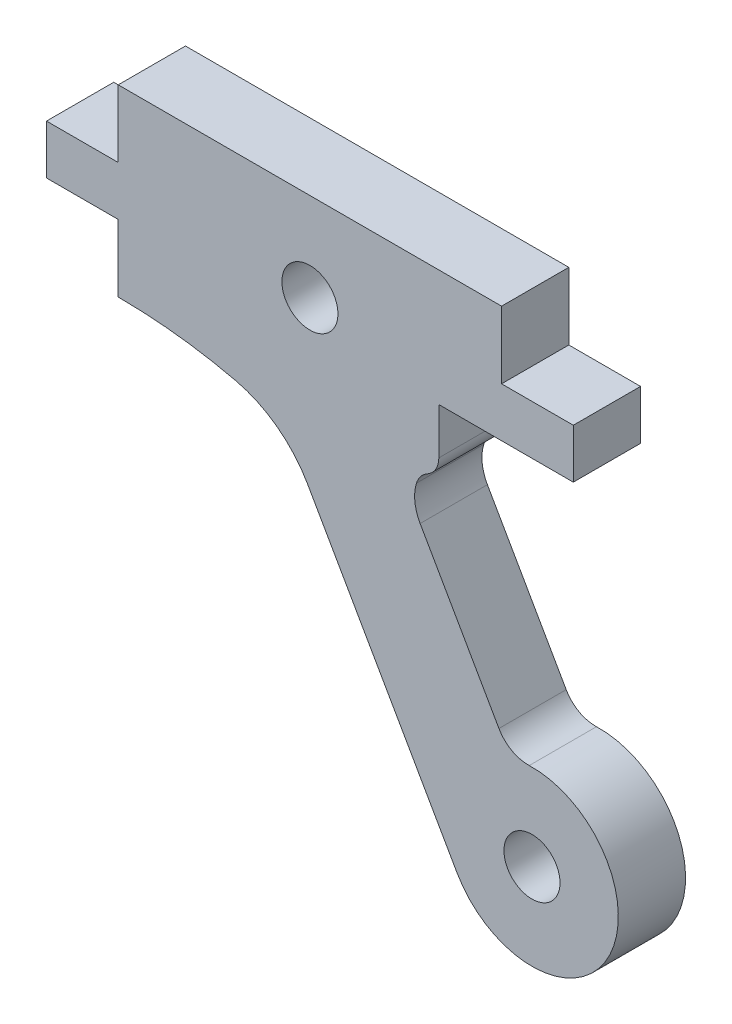
ISO-10303-21;
HEADER;
FILE_DESCRIPTION(('STEP AP214'),'2;1');
FILE_NAME('part.step','',(''),(''),'','','');
FILE_SCHEMA(('AUTOMOTIVE_DESIGN { 1 0 10303 214 1 1 1 1 }'));
ENDSEC;
DATA;
#1=APPLICATION_CONTEXT('core data for automotive mechanical design processes');
#2=APPLICATION_PROTOCOL_DEFINITION('international standard','automotive_design',2000,#1);
#3=PRODUCT_CONTEXT('',#1,'mechanical');
#4=PRODUCT('Part','Part','',(#3));
#5=PRODUCT_RELATED_PRODUCT_CATEGORY('part','',(#4));
#6=PRODUCT_DEFINITION_FORMATION('','',#4);
#7=PRODUCT_DEFINITION_CONTEXT('part definition',#1,'design');
#8=PRODUCT_DEFINITION('design','',#6,#7);
#9=PRODUCT_DEFINITION_SHAPE('','',#8);
#10=(LENGTH_UNIT() NAMED_UNIT(*) SI_UNIT(.MILLI.,.METRE.));
#11=(NAMED_UNIT(*) PLANE_ANGLE_UNIT() SI_UNIT($,.RADIAN.));
#12=(NAMED_UNIT(*) SI_UNIT($,.STERADIAN.) SOLID_ANGLE_UNIT());
#13=UNCERTAINTY_MEASURE_WITH_UNIT(LENGTH_MEASURE(1.E-05),#10,'distance_accuracy_value','');
#14=(GEOMETRIC_REPRESENTATION_CONTEXT(3) GLOBAL_UNCERTAINTY_ASSIGNED_CONTEXT((#13)) GLOBAL_UNIT_ASSIGNED_CONTEXT((#10,
#11,#12)) REPRESENTATION_CONTEXT('',''));
#15=CARTESIAN_POINT('',(0.,0.,0.));
#16=DIRECTION('',(0.,0.,1.));
#17=DIRECTION('',(1.,0.,0.));
#18=AXIS2_PLACEMENT_3D('',#15,#16,#17);
#19=CARTESIAN_POINT('',(-230.853955802603,-686.690990553707,-3.));
#20=DIRECTION('',(-1.,0.,0.));
#21=DIRECTION('',(0.,0.,1.));
#22=AXIS2_PLACEMENT_3D('',#19,#20,#21);
#23=PLANE('',#22);
#24=DIRECTION('',(0.,-1.,0.));
#25=VECTOR('',#24,1.);
#26=CARTESIAN_POINT('',(-230.853955802603,-686.690990553707,0.));
#27=LINE('',#26,#25);
#28=CARTESIAN_POINT('',(-230.853955802603,-686.690990553707,0.));
#29=VERTEX_POINT('',#28);
#30=CARTESIAN_POINT('',(-230.853955802603,-689.690990553707,0.));
#31=VERTEX_POINT('',#30);
#32=EDGE_CURVE('E208',#29,#31,#27,.T.);
#33=ORIENTED_EDGE('',*,*,#32,.F.);
#34=DIRECTION('',(0.,0.,1.));
#35=VECTOR('',#34,1.);
#36=CARTESIAN_POINT('',(-230.853955802603,-686.690990553707,-3.));
#37=LINE('',#36,#35);
#38=CARTESIAN_POINT('',(-230.853955802603,-686.690990553707,-3.));
#39=VERTEX_POINT('',#38);
#40=EDGE_CURVE('E11',#39,#29,#37,.T.);
#41=ORIENTED_EDGE('',*,*,#40,.F.);
#42=DIRECTION('',(0.,-1.,0.));
#43=VECTOR('',#42,1.);
#44=CARTESIAN_POINT('',(-230.853955802603,-686.690990553707,-3.));
#45=LINE('',#44,#43);
#46=CARTESIAN_POINT('',(-230.853955802603,-689.690990553707,-3.));
#47=VERTEX_POINT('',#46);
#48=EDGE_CURVE('E265',#39,#47,#45,.T.);
#49=ORIENTED_EDGE('',*,*,#48,.T.);
#50=DIRECTION('',(0.,0.,1.));
#51=VECTOR('',#50,1.);
#52=CARTESIAN_POINT('',(-230.853955802603,-689.690990553707,-3.));
#53=LINE('',#52,#51);
#54=EDGE_CURVE('E42',#47,#31,#53,.T.);
#55=ORIENTED_EDGE('',*,*,#54,.T.);
#56=EDGE_LOOP('',(#33,#41,#49,#55));
#57=FACE_BOUND('',#56,.T.);
#58=ADVANCED_FACE('F39',(#57),#23,.T.);
#59=CARTESIAN_POINT('',(-230.853955802603,-686.690990553707,-3.));
#60=DIRECTION('',(0.,1.,0.));
#61=DIRECTION('',(0.,0.,1.));
#62=AXIS2_PLACEMENT_3D('',#59,#60,#61);
#63=PLANE('',#62);
#64=DIRECTION('',(-1.,0.,0.));
#65=VECTOR('',#64,1.);
#66=CARTESIAN_POINT('',(-230.853955802603,-686.690990553707,0.));
#67=LINE('',#66,#65);
#68=CARTESIAN_POINT('',(-213.753955802603,-686.690990553707,0.));
#69=VERTEX_POINT('',#68);
#70=EDGE_CURVE('E263',#69,#29,#67,.T.);
#71=ORIENTED_EDGE('',*,*,#70,.F.);
#72=DIRECTION('',(0.,0.,1.));
#73=VECTOR('',#72,1.);
#74=CARTESIAN_POINT('',(-213.753955802603,-686.690990553707,-3.));
#75=LINE('',#74,#73);
#76=CARTESIAN_POINT('',(-213.753955802603,-686.690990553707,-3.));
#77=VERTEX_POINT('',#76);
#78=EDGE_CURVE('E48',#77,#69,#75,.T.);
#79=ORIENTED_EDGE('',*,*,#78,.F.);
#80=DIRECTION('',(-1.,0.,0.));
#81=VECTOR('',#80,1.);
#82=CARTESIAN_POINT('',(-230.853955802603,-686.690990553707,-3.));
#83=LINE('',#82,#81);
#84=EDGE_CURVE('E198',#77,#39,#83,.T.);
#85=ORIENTED_EDGE('',*,*,#84,.T.);
#86=ORIENTED_EDGE('',*,*,#40,.T.);
#87=EDGE_LOOP('',(#71,#79,#85,#86));
#88=FACE_BOUND('',#87,.T.);
#89=ADVANCED_FACE('F301',(#88),#63,.T.);
#90=CARTESIAN_POINT('',(-213.753955802603,-686.690990553707,-3.));
#91=DIRECTION('',(1.,0.,0.));
#92=DIRECTION('',(0.,0.,-1.));
#93=AXIS2_PLACEMENT_3D('',#90,#91,#92);
#94=PLANE('',#93);
#95=DIRECTION('',(0.,1.,0.));
#96=VECTOR('',#95,1.);
#97=CARTESIAN_POINT('',(-213.753955802603,-686.690990553707,0.));
#98=LINE('',#97,#96);
#99=CARTESIAN_POINT('',(-213.753955802603,-689.690990553707,0.));
#100=VERTEX_POINT('',#99);
#101=EDGE_CURVE('E185',#100,#69,#98,.T.);
#102=ORIENTED_EDGE('',*,*,#101,.F.);
#103=DIRECTION('',(0.,0.,1.));
#104=VECTOR('',#103,1.);
#105=CARTESIAN_POINT('',(-213.753955802603,-689.690990553707,-3.));
#106=LINE('',#105,#104);
#107=CARTESIAN_POINT('',(-213.753955802603,-689.690990553707,-3.));
#108=VERTEX_POINT('',#107);
#109=EDGE_CURVE('E180',#108,#100,#106,.T.);
#110=ORIENTED_EDGE('',*,*,#109,.F.);
#111=DIRECTION('',(0.,1.,0.));
#112=VECTOR('',#111,1.);
#113=CARTESIAN_POINT('',(-213.753955802603,-686.690990553707,-3.));
#114=LINE('',#113,#112);
#115=EDGE_CURVE('E183',#108,#77,#114,.T.);
#116=ORIENTED_EDGE('',*,*,#115,.T.);
#117=ORIENTED_EDGE('',*,*,#78,.T.);
#118=EDGE_LOOP('',(#102,#110,#116,#117));
#119=FACE_BOUND('',#118,.T.);
#120=ADVANCED_FACE('F182',(#119),#94,.T.);
#121=CARTESIAN_POINT('',(-213.753955802603,-689.690990553707,-3.));
#122=DIRECTION('',(0.,1.,0.));
#123=DIRECTION('',(0.,0.,1.));
#124=AXIS2_PLACEMENT_3D('',#121,#122,#123);
#125=PLANE('',#124);
#126=DIRECTION('',(-1.,0.,0.));
#127=VECTOR('',#126,1.);
#128=CARTESIAN_POINT('',(-213.753955802603,-689.690990553707,0.));
#129=LINE('',#128,#127);
#130=CARTESIAN_POINT('',(-210.553955802603,-689.690990553707,0.));
#131=VERTEX_POINT('',#130);
#132=EDGE_CURVE('E260',#131,#100,#129,.T.);
#133=ORIENTED_EDGE('',*,*,#132,.F.);
#134=DIRECTION('',(0.,0.,1.));
#135=VECTOR('',#134,1.);
#136=CARTESIAN_POINT('',(-210.553955802603,-689.690990553707,-3.));
#137=LINE('',#136,#135);
#138=CARTESIAN_POINT('',(-210.553955802603,-689.690990553707,-3.));
#139=VERTEX_POINT('',#138);
#140=EDGE_CURVE('E190',#139,#131,#137,.T.);
#141=ORIENTED_EDGE('',*,*,#140,.F.);
#142=DIRECTION('',(-1.,0.,0.));
#143=VECTOR('',#142,1.);
#144=CARTESIAN_POINT('',(-213.753955802603,-689.690990553707,-3.));
#145=LINE('',#144,#143);
#146=EDGE_CURVE('E196',#139,#108,#145,.T.);
#147=ORIENTED_EDGE('',*,*,#146,.T.);
#148=ORIENTED_EDGE('',*,*,#109,.T.);
#149=EDGE_LOOP('',(#133,#141,#147,#148));
#150=FACE_BOUND('',#149,.T.);
#151=ADVANCED_FACE('F200',(#150),#125,.T.);
#152=CARTESIAN_POINT('',(-210.553955802603,-689.690990553707,-3.));
#153=DIRECTION('',(1.,0.,0.));
#154=DIRECTION('',(0.,0.,-1.));
#155=AXIS2_PLACEMENT_3D('',#152,#153,#154);
#156=PLANE('',#155);
#157=DIRECTION('',(0.,1.,0.));
#158=VECTOR('',#157,1.);
#159=CARTESIAN_POINT('',(-210.553955802603,-689.690990553707,0.));
#160=LINE('',#159,#158);
#161=CARTESIAN_POINT('',(-210.553955802603,-691.890990553707,0.));
#162=VERTEX_POINT('',#161);
#163=EDGE_CURVE('E257',#162,#131,#160,.T.);
#164=ORIENTED_EDGE('',*,*,#163,.F.);
#165=DIRECTION('',(0.,0.,1.));
#166=VECTOR('',#165,1.);
#167=CARTESIAN_POINT('',(-210.553955802603,-691.890990553707,-3.));
#168=LINE('',#167,#166);
#169=CARTESIAN_POINT('',(-210.553955802603,-691.890990553707,-3.));
#170=VERTEX_POINT('',#169);
#171=EDGE_CURVE('E269',#170,#162,#168,.T.);
#172=ORIENTED_EDGE('',*,*,#171,.F.);
#173=DIRECTION('',(0.,1.,0.));
#174=VECTOR('',#173,1.);
#175=CARTESIAN_POINT('',(-210.553955802603,-689.690990553707,-3.));
#176=LINE('',#175,#174);
#177=EDGE_CURVE('E201',#170,#139,#176,.T.);
#178=ORIENTED_EDGE('',*,*,#177,.T.);
#179=ORIENTED_EDGE('',*,*,#140,.T.);
#180=EDGE_LOOP('',(#164,#172,#178,#179));
#181=FACE_BOUND('',#180,.T.);
#182=ADVANCED_FACE('F314',(#181),#156,.T.);
#183=CARTESIAN_POINT('',(-210.553955802603,-691.890990553707,-3.));
#184=DIRECTION('',(0.,-1.,0.));
#185=DIRECTION('',(0.,0.,-1.));
#186=AXIS2_PLACEMENT_3D('',#183,#184,#185);
#187=PLANE('',#186);
#188=DIRECTION('',(1.,0.,0.));
#189=VECTOR('',#188,1.);
#190=CARTESIAN_POINT('',(-210.553955802603,-691.890990553707,0.));
#191=LINE('',#190,#189);
#192=CARTESIAN_POINT('',(-216.553955802603,-691.890990553707,0.));
#193=VERTEX_POINT('',#192);
#194=EDGE_CURVE('E254',#193,#162,#191,.T.);
#195=ORIENTED_EDGE('',*,*,#194,.F.);
#196=DIRECTION('',(0.,0.,1.));
#197=VECTOR('',#196,1.);
#198=CARTESIAN_POINT('',(-216.553955802603,-691.890990553707,-3.));
#199=LINE('',#198,#197);
#200=CARTESIAN_POINT('',(-216.553955802603,-691.890990553707,-3.));
#201=VERTEX_POINT('',#200);
#202=EDGE_CURVE('E271',#201,#193,#199,.T.);
#203=ORIENTED_EDGE('',*,*,#202,.F.);
#204=DIRECTION('',(1.,0.,0.));
#205=VECTOR('',#204,1.);
#206=CARTESIAN_POINT('',(-210.553955802603,-691.890990553707,-3.));
#207=LINE('',#206,#205);
#208=EDGE_CURVE('E203',#201,#170,#207,.T.);
#209=ORIENTED_EDGE('',*,*,#208,.T.);
#210=ORIENTED_EDGE('',*,*,#171,.T.);
#211=EDGE_LOOP('',(#195,#203,#209,#210));
#212=FACE_BOUND('',#211,.T.);
#213=ADVANCED_FACE('F317',(#212),#187,.T.);
#214=CARTESIAN_POINT('',(-216.553955802603,-691.890990553707,-3.));
#215=DIRECTION('',(1.,0.,0.));
#216=DIRECTION('',(0.,0.,-1.));
#217=AXIS2_PLACEMENT_3D('',#214,#215,#216);
#218=PLANE('',#217);
#219=DIRECTION('',(0.,1.,0.));
#220=VECTOR('',#219,1.);
#221=CARTESIAN_POINT('',(-216.553955802603,-691.890990553707,0.));
#222=LINE('',#221,#220);
#223=CARTESIAN_POINT('',(-216.553955802603,-693.952807749183,0.));
#224=VERTEX_POINT('',#223);
#225=EDGE_CURVE('E251',#224,#193,#222,.T.);
#226=ORIENTED_EDGE('',*,*,#225,.F.);
#227=DIRECTION('',(0.,0.,1.));
#228=VECTOR('',#227,1.);
#229=CARTESIAN_POINT('',(-216.553955802603,-693.952807749183,-3.));
#230=LINE('',#229,#228);
#231=CARTESIAN_POINT('',(-216.553955802603,-693.952807749183,-3.));
#232=VERTEX_POINT('',#231);
#233=EDGE_CURVE('E273',#232,#224,#230,.T.);
#234=ORIENTED_EDGE('',*,*,#233,.F.);
#235=DIRECTION('',(0.,1.,0.));
#236=VECTOR('',#235,1.);
#237=CARTESIAN_POINT('',(-216.553955802603,-691.890990553707,-3.));
#238=LINE('',#237,#236);
#239=EDGE_CURVE('E447',#232,#201,#238,.T.);
#240=ORIENTED_EDGE('',*,*,#239,.T.);
#241=ORIENTED_EDGE('',*,*,#202,.T.);
#242=EDGE_LOOP('',(#226,#234,#240,#241));
#243=FACE_BOUND('',#242,.T.);
#244=ADVANCED_FACE('F321',(#243),#218,.T.);
#245=CARTESIAN_POINT('',(-217.553955802603,-693.952807749183,-3.));
#246=DIRECTION('',(0.,0.,1.));
#247=DIRECTION('',(1.,0.,0.));
#248=AXIS2_PLACEMENT_3D('',#245,#246,#247);
#249=CYLINDRICAL_SURFACE('',#248,0.999999999999994);
#250=CARTESIAN_POINT('',(-217.553955802603,-693.952807749183,0.));
#251=DIRECTION('',(0.,0.,1.));
#252=DIRECTION('',(-1.,0.,0.));
#253=AXIS2_PLACEMENT_3D('',#250,#251,#252);
#254=CIRCLE('',#253,0.999999999999994);
#255=CARTESIAN_POINT('',(-217.06391298613,-694.824506113311,0.));
#256=VERTEX_POINT('',#255);
#257=EDGE_CURVE('E248',#256,#224,#254,.T.);
#258=ORIENTED_EDGE('',*,*,#257,.F.);
#259=DIRECTION('',(0.,0.,1.));
#260=VECTOR('',#259,1.);
#261=CARTESIAN_POINT('',(-217.06391298613,-694.824506113311,-3.));
#262=LINE('',#261,#260);
#263=CARTESIAN_POINT('',(-217.06391298613,-694.824506113311,-3.));
#264=VERTEX_POINT('',#263);
#265=EDGE_CURVE('E275',#264,#256,#262,.T.);
#266=ORIENTED_EDGE('',*,*,#265,.F.);
#267=CARTESIAN_POINT('',(-217.553955802603,-693.952807749183,-3.));
#268=DIRECTION('',(0.,0.,1.));
#269=DIRECTION('',(-1.,0.,0.));
#270=AXIS2_PLACEMENT_3D('',#267,#268,#269);
#271=CIRCLE('',#270,0.999999999999994);
#272=EDGE_CURVE('E444',#264,#232,#271,.T.);
#273=ORIENTED_EDGE('',*,*,#272,.T.);
#274=ORIENTED_EDGE('',*,*,#233,.T.);
#275=EDGE_LOOP('',(#258,#266,#273,#274));
#276=FACE_BOUND('',#275,.T.);
#277=ADVANCED_FACE('F325',(#276),#249,.T.);
#278=CARTESIAN_POINT('',(-216.553955802603,-695.73162856815,-3.));
#279=DIRECTION('',(0.,0.,1.));
#280=DIRECTION('',(1.,0.,0.));
#281=AXIS2_PLACEMENT_3D('',#278,#279,#280);
#282=CYLINDRICAL_SURFACE('',#281,1.04063801444277);
#283=CARTESIAN_POINT('',(-216.553955802603,-695.73162856815,0.));
#284=DIRECTION('',(0.,0.,-1.));
#285=DIRECTION('',(-1.,0.,0.));
#286=AXIS2_PLACEMENT_3D('',#283,#284,#285);
#287=CIRCLE('',#286,1.04063801444277);
#288=CARTESIAN_POINT('',(-217.547910270791,-695.423437081777,0.));
#289=VERTEX_POINT('',#288);
#290=EDGE_CURVE('E245',#289,#256,#287,.T.);
#291=ORIENTED_EDGE('',*,*,#290,.F.);
#292=DIRECTION('',(0.,0.,1.));
#293=VECTOR('',#292,1.);
#294=CARTESIAN_POINT('',(-217.547910270791,-695.423437081777,-3.));
#295=LINE('',#294,#293);
#296=CARTESIAN_POINT('',(-217.547910270791,-695.423437081777,-3.));
#297=VERTEX_POINT('',#296);
#298=EDGE_CURVE('E277',#297,#289,#295,.T.);
#299=ORIENTED_EDGE('',*,*,#298,.F.);
#300=CARTESIAN_POINT('',(-216.553955802603,-695.73162856815,-3.));
#301=DIRECTION('',(0.,0.,-1.));
#302=DIRECTION('',(-1.,0.,0.));
#303=AXIS2_PLACEMENT_3D('',#300,#301,#302);
#304=CIRCLE('',#303,1.04063801444277);
#305=EDGE_CURVE('E441',#297,#264,#304,.T.);
#306=ORIENTED_EDGE('',*,*,#305,.T.);
#307=ORIENTED_EDGE('',*,*,#265,.T.);
#308=EDGE_LOOP('',(#291,#299,#306,#307));
#309=FACE_BOUND('',#308,.T.);
#310=ADVANCED_FACE('F329',(#309),#282,.F.);
#311=CARTESIAN_POINT('',(-215.762219908737,-695.977118950008,-3.));
#312=DIRECTION('',(0.,0.,1.));
#313=DIRECTION('',(1.,0.,0.));
#314=AXIS2_PLACEMENT_3D('',#311,#312,#313);
#315=CYLINDRICAL_SURFACE('',#314,1.86955975575522);
#316=CARTESIAN_POINT('',(-215.762219908737,-695.977118950008,0.));
#317=DIRECTION('',(0.,0.,-1.));
#318=DIRECTION('',(-1.,0.,0.));
#319=AXIS2_PLACEMENT_3D('',#316,#317,#318);
#320=CIRCLE('',#319,1.86955975575522);
#321=CARTESIAN_POINT('',(-217.386158099482,-696.903444180681,0.));
#322=VERTEX_POINT('',#321);
#323=EDGE_CURVE('E242',#322,#289,#320,.T.);
#324=ORIENTED_EDGE('',*,*,#323,.F.);
#325=DIRECTION('',(0.,0.,1.));
#326=VECTOR('',#325,1.);
#327=CARTESIAN_POINT('',(-217.386158099482,-696.903444180681,-3.));
#328=LINE('',#327,#326);
#329=CARTESIAN_POINT('',(-217.386158099482,-696.903444180681,-3.));
#330=VERTEX_POINT('',#329);
#331=EDGE_CURVE('E279',#330,#322,#328,.T.);
#332=ORIENTED_EDGE('',*,*,#331,.F.);
#333=CARTESIAN_POINT('',(-215.762219908737,-695.977118950008,-3.));
#334=DIRECTION('',(0.,0.,-1.));
#335=DIRECTION('',(-1.,0.,0.));
#336=AXIS2_PLACEMENT_3D('',#333,#334,#335);
#337=CIRCLE('',#336,1.86955975575522);
#338=EDGE_CURVE('E438',#330,#297,#337,.T.);
#339=ORIENTED_EDGE('',*,*,#338,.T.);
#340=ORIENTED_EDGE('',*,*,#298,.T.);
#341=EDGE_LOOP('',(#324,#332,#339,#340));
#342=FACE_BOUND('',#341,.T.);
#343=ADVANCED_FACE('F333',(#342),#315,.F.);
#344=CARTESIAN_POINT('',(-217.386158099482,-696.903444180681,-3.));
#345=DIRECTION('',(0.868620639562405,0.495477733633106,0.));
#346=DIRECTION('',(-0.495477733633106,0.868620639562405,0.));
#347=AXIS2_PLACEMENT_3D('',#344,#345,#346);
#348=PLANE('',#347);
#349=DIRECTION('',(-0.495477733633106,0.868620639562405,0.));
#350=VECTOR('',#349,1.);
#351=CARTESIAN_POINT('',(-217.386158099482,-696.903444180681,0.));
#352=LINE('',#351,#350);
#353=CARTESIAN_POINT('',(-213.871752669023,-703.06453858608,0.));
#354=VERTEX_POINT('',#353);
#355=EDGE_CURVE('E239',#354,#322,#352,.T.);
#356=ORIENTED_EDGE('',*,*,#355,.F.);
#357=DIRECTION('',(0.,0.,1.));
#358=VECTOR('',#357,1.);
#359=CARTESIAN_POINT('',(-213.871752669023,-703.06453858608,-3.));
#360=LINE('',#359,#358);
#361=CARTESIAN_POINT('',(-213.871752669023,-703.06453858608,-3.));
#362=VERTEX_POINT('',#361);
#363=EDGE_CURVE('E281',#362,#354,#360,.T.);
#364=ORIENTED_EDGE('',*,*,#363,.F.);
#365=DIRECTION('',(-0.495477733633106,0.868620639562405,0.));
#366=VECTOR('',#365,1.);
#367=CARTESIAN_POINT('',(-217.386158099482,-696.903444180681,-3.));
#368=LINE('',#367,#366);
#369=EDGE_CURVE('E435',#362,#330,#368,.T.);
#370=ORIENTED_EDGE('',*,*,#369,.T.);
#371=ORIENTED_EDGE('',*,*,#331,.T.);
#372=EDGE_LOOP('',(#356,#364,#370,#371));
#373=FACE_BOUND('',#372,.T.);
#374=ADVANCED_FACE('F337',(#373),#348,.T.);
#375=CARTESIAN_POINT('',(-212.568821709679,-702.32132198563,-3.));
#376=DIRECTION('',(0.,0.,1.));
#377=DIRECTION('',(1.,0.,0.));
#378=AXIS2_PLACEMENT_3D('',#375,#376,#377);
#379=CYLINDRICAL_SURFACE('',#378,1.49999999999998);
#380=CARTESIAN_POINT('',(-212.568821709679,-702.32132198563,0.));
#381=DIRECTION('',(0.,0.,-1.));
#382=DIRECTION('',(-1.,0.,0.));
#383=AXIS2_PLACEMENT_3D('',#380,#381,#382);
#384=CIRCLE('',#383,1.49999999999998);
#385=CARTESIAN_POINT('',(-212.520587000151,-703.820546255977,0.));
#386=VERTEX_POINT('',#385);
#387=EDGE_CURVE('E236',#386,#354,#384,.T.);
#388=ORIENTED_EDGE('',*,*,#387,.F.);
#389=DIRECTION('',(0.,0.,1.));
#390=VECTOR('',#389,1.);
#391=CARTESIAN_POINT('',(-212.520587000151,-703.820546255977,-3.));
#392=LINE('',#391,#390);
#393=CARTESIAN_POINT('',(-212.520587000151,-703.820546255977,-3.));
#394=VERTEX_POINT('',#393);
#395=EDGE_CURVE('E283',#394,#386,#392,.T.);
#396=ORIENTED_EDGE('',*,*,#395,.F.);
#397=CARTESIAN_POINT('',(-212.568821709679,-702.32132198563,-3.));
#398=DIRECTION('',(0.,0.,-1.));
#399=DIRECTION('',(-1.,0.,0.));
#400=AXIS2_PLACEMENT_3D('',#397,#398,#399);
#401=CIRCLE('',#400,1.49999999999998);
#402=EDGE_CURVE('E432',#394,#362,#401,.T.);
#403=ORIENTED_EDGE('',*,*,#402,.T.);
#404=ORIENTED_EDGE('',*,*,#363,.T.);
#405=EDGE_LOOP('',(#388,#396,#403,#404));
#406=FACE_BOUND('',#405,.T.);
#407=ADVANCED_FACE('F341',(#406),#379,.F.);
#408=CARTESIAN_POINT('',(-212.396784579027,-707.668555216534,-3.));
#409=DIRECTION('',(0.,0.,1.));
#410=DIRECTION('',(1.,0.,0.));
#411=AXIS2_PLACEMENT_3D('',#408,#409,#410);
#412=CYLINDRICAL_SURFACE('',#411,3.85000000000003);
#413=CARTESIAN_POINT('',(-212.396784579027,-707.668555216534,0.));
#414=DIRECTION('',(0.,0.,1.));
#415=DIRECTION('',(1.,0.,0.));
#416=AXIS2_PLACEMENT_3D('',#413,#414,#415);
#417=CIRCLE('',#416,3.85000000000003);
#418=CARTESIAN_POINT('',(-215.740974041343,-709.576144491021,0.));
#419=VERTEX_POINT('',#418);
#420=EDGE_CURVE('E233',#419,#386,#417,.T.);
#421=ORIENTED_EDGE('',*,*,#420,.F.);
#422=DIRECTION('',(0.,0.,1.));
#423=VECTOR('',#422,1.);
#424=CARTESIAN_POINT('',(-215.740974041343,-709.576144491021,-3.));
#425=LINE('',#424,#423);
#426=CARTESIAN_POINT('',(-215.740974041343,-709.576144491021,-3.));
#427=VERTEX_POINT('',#426);
#428=EDGE_CURVE('E285',#427,#419,#425,.T.);
#429=ORIENTED_EDGE('',*,*,#428,.F.);
#430=CARTESIAN_POINT('',(-212.396784579027,-707.668555216534,-3.));
#431=DIRECTION('',(0.,0.,1.));
#432=DIRECTION('',(1.,0.,0.));
#433=AXIS2_PLACEMENT_3D('',#430,#431,#432);
#434=CIRCLE('',#433,3.85000000000003);
#435=EDGE_CURVE('E429',#427,#394,#434,.T.);
#436=ORIENTED_EDGE('',*,*,#435,.T.);
#437=ORIENTED_EDGE('',*,*,#395,.T.);
#438=EDGE_LOOP('',(#421,#429,#436,#437));
#439=FACE_BOUND('',#438,.T.);
#440=ADVANCED_FACE('F345',(#439),#412,.T.);
#441=CARTESIAN_POINT('',(-222.406408094269,-697.890990553707,-3.));
#442=DIRECTION('',(-0.868620639562404,-0.495477733633107,0.));
#443=DIRECTION('',(0.495477733633107,-0.868620639562404,0.));
#444=AXIS2_PLACEMENT_3D('',#441,#442,#443);
#445=PLANE('',#444);
#446=DIRECTION('',(0.495477733633107,-0.868620639562404,0.));
#447=VECTOR('',#446,1.);
#448=CARTESIAN_POINT('',(-222.406408094269,-697.890990553707,0.));
#449=LINE('',#448,#447);
#450=CARTESIAN_POINT('',(-222.406408094269,-697.890990553707,0.));
#451=VERTEX_POINT('',#450);
#452=EDGE_CURVE('E230',#451,#419,#449,.T.);
#453=ORIENTED_EDGE('',*,*,#452,.F.);
#454=DIRECTION('',(0.,0.,1.));
#455=VECTOR('',#454,1.);
#456=CARTESIAN_POINT('',(-222.406408094269,-697.890990553707,-3.));
#457=LINE('',#456,#455);
#458=CARTESIAN_POINT('',(-222.406408094269,-697.890990553707,-3.));
#459=VERTEX_POINT('',#458);
#460=EDGE_CURVE('E287',#459,#451,#457,.T.);
#461=ORIENTED_EDGE('',*,*,#460,.F.);
#462=DIRECTION('',(0.495477733633107,-0.868620639562404,0.));
#463=VECTOR('',#462,1.);
#464=CARTESIAN_POINT('',(-222.406408094269,-697.890990553707,-3.));
#465=LINE('',#464,#463);
#466=EDGE_CURVE('E426',#459,#427,#465,.T.);
#467=ORIENTED_EDGE('',*,*,#466,.T.);
#468=ORIENTED_EDGE('',*,*,#428,.T.);
#469=EDGE_LOOP('',(#453,#461,#467,#468));
#470=FACE_BOUND('',#469,.T.);
#471=ADVANCED_FACE('F349',(#470),#445,.T.);
#472=CARTESIAN_POINT('',(-226.753857709078,-700.370858500794,-3.));
#473=DIRECTION('',(0.,0.,1.));
#474=DIRECTION('',(1.,0.,0.));
#475=AXIS2_PLACEMENT_3D('',#472,#473,#474);
#476=CYLINDRICAL_SURFACE('',#475,5.00500381501273);
#477=CARTESIAN_POINT('',(-226.753857709078,-700.370858500794,0.));
#478=DIRECTION('',(0.,0.,-1.));
#479=DIRECTION('',(-1.,0.,0.));
#480=AXIS2_PLACEMENT_3D('',#477,#478,#479);
#481=CIRCLE('',#480,5.00500381501273);
#482=CARTESIAN_POINT('',(-225.609866372329,-695.498349187337,0.));
#483=VERTEX_POINT('',#482);
#484=EDGE_CURVE('E227',#483,#451,#481,.T.);
#485=ORIENTED_EDGE('',*,*,#484,.F.);
#486=DIRECTION('',(0.,0.,1.));
#487=VECTOR('',#486,1.);
#488=CARTESIAN_POINT('',(-225.609866372329,-695.498349187337,-3.));
#489=LINE('',#488,#487);
#490=CARTESIAN_POINT('',(-225.609866372329,-695.498349187337,-3.));
#491=VERTEX_POINT('',#490);
#492=EDGE_CURVE('E289',#491,#483,#489,.T.);
#493=ORIENTED_EDGE('',*,*,#492,.F.);
#494=CARTESIAN_POINT('',(-226.753857709078,-700.370858500794,-3.));
#495=DIRECTION('',(0.,0.,-1.));
#496=DIRECTION('',(-1.,0.,0.));
#497=AXIS2_PLACEMENT_3D('',#494,#495,#496);
#498=CIRCLE('',#497,5.00500381501273);
#499=EDGE_CURVE('E423',#491,#459,#498,.T.);
#500=ORIENTED_EDGE('',*,*,#499,.T.);
#501=ORIENTED_EDGE('',*,*,#460,.T.);
#502=EDGE_LOOP('',(#485,#493,#500,#501));
#503=FACE_BOUND('',#502,.T.);
#504=ADVANCED_FACE('F353',(#503),#476,.F.);
#505=CARTESIAN_POINT('',(-230.853955802598,-717.834073041852,-3.));
#506=DIRECTION('',(0.,0.,1.));
#507=DIRECTION('',(1.,0.,0.));
#508=AXIS2_PLACEMENT_3D('',#505,#506,#507);
#509=CYLINDRICAL_SURFACE('',#508,22.9430824881454);
#510=CARTESIAN_POINT('',(-230.853955802598,-717.834073041852,0.));
#511=DIRECTION('',(0.,0.,-1.));
#512=DIRECTION('',(-1.,0.,0.));
#513=AXIS2_PLACEMENT_3D('',#510,#511,#512);
#514=CIRCLE('',#513,22.9430824881454);
#515=CARTESIAN_POINT('',(-230.853955802603,-694.890990553707,0.));
#516=VERTEX_POINT('',#515);
#517=EDGE_CURVE('E224',#516,#483,#514,.T.);
#518=ORIENTED_EDGE('',*,*,#517,.F.);
#519=DIRECTION('',(0.,0.,1.));
#520=VECTOR('',#519,1.);
#521=CARTESIAN_POINT('',(-230.853955802603,-694.890990553707,-3.));
#522=LINE('',#521,#520);
#523=CARTESIAN_POINT('',(-230.853955802603,-694.890990553707,-3.));
#524=VERTEX_POINT('',#523);
#525=EDGE_CURVE('E291',#524,#516,#522,.T.);
#526=ORIENTED_EDGE('',*,*,#525,.F.);
#527=CARTESIAN_POINT('',(-230.853955802598,-717.834073041852,-3.));
#528=DIRECTION('',(0.,0.,-1.));
#529=DIRECTION('',(-1.,0.,0.));
#530=AXIS2_PLACEMENT_3D('',#527,#528,#529);
#531=CIRCLE('',#530,22.9430824881454);
#532=EDGE_CURVE('E420',#524,#491,#531,.T.);
#533=ORIENTED_EDGE('',*,*,#532,.T.);
#534=ORIENTED_EDGE('',*,*,#492,.T.);
#535=EDGE_LOOP('',(#518,#526,#533,#534));
#536=FACE_BOUND('',#535,.T.);
#537=ADVANCED_FACE('F357',(#536),#509,.F.);
#538=CARTESIAN_POINT('',(-230.853955802603,-691.890990553707,-3.));
#539=DIRECTION('',(-1.,0.,0.));
#540=DIRECTION('',(0.,0.,1.));
#541=AXIS2_PLACEMENT_3D('',#538,#539,#540);
#542=PLANE('',#541);
#543=DIRECTION('',(0.,-1.,0.));
#544=VECTOR('',#543,1.);
#545=CARTESIAN_POINT('',(-230.853955802603,-691.890990553707,0.));
#546=LINE('',#545,#544);
#547=CARTESIAN_POINT('',(-230.853955802603,-691.890990553707,0.));
#548=VERTEX_POINT('',#547);
#549=EDGE_CURVE('E221',#548,#516,#546,.T.);
#550=ORIENTED_EDGE('',*,*,#549,.F.);
#551=DIRECTION('',(0.,0.,1.));
#552=VECTOR('',#551,1.);
#553=CARTESIAN_POINT('',(-230.853955802603,-691.890990553707,-3.));
#554=LINE('',#553,#552);
#555=CARTESIAN_POINT('',(-230.853955802603,-691.890990553707,-3.));
#556=VERTEX_POINT('',#555);
#557=EDGE_CURVE('E293',#556,#548,#554,.T.);
#558=ORIENTED_EDGE('',*,*,#557,.F.);
#559=DIRECTION('',(0.,-1.,0.));
#560=VECTOR('',#559,1.);
#561=CARTESIAN_POINT('',(-230.853955802603,-691.890990553707,-3.));
#562=LINE('',#561,#560);
#563=EDGE_CURVE('E417',#556,#524,#562,.T.);
#564=ORIENTED_EDGE('',*,*,#563,.T.);
#565=ORIENTED_EDGE('',*,*,#525,.T.);
#566=EDGE_LOOP('',(#550,#558,#564,#565));
#567=FACE_BOUND('',#566,.T.);
#568=ADVANCED_FACE('F361',(#567),#542,.T.);
#569=CARTESIAN_POINT('',(-234.053955802603,-691.890990553707,-3.));
#570=DIRECTION('',(0.,-1.,0.));
#571=DIRECTION('',(0.,0.,-1.));
#572=AXIS2_PLACEMENT_3D('',#569,#570,#571);
#573=PLANE('',#572);
#574=DIRECTION('',(1.,0.,0.));
#575=VECTOR('',#574,1.);
#576=CARTESIAN_POINT('',(-234.053955802603,-691.890990553707,0.));
#577=LINE('',#576,#575);
#578=CARTESIAN_POINT('',(-234.053955802603,-691.890990553707,0.));
#579=VERTEX_POINT('',#578);
#580=EDGE_CURVE('E218',#579,#548,#577,.T.);
#581=ORIENTED_EDGE('',*,*,#580,.F.);
#582=DIRECTION('',(0.,0.,1.));
#583=VECTOR('',#582,1.);
#584=CARTESIAN_POINT('',(-234.053955802603,-691.890990553707,-3.));
#585=LINE('',#584,#583);
#586=CARTESIAN_POINT('',(-234.053955802603,-691.890990553707,-3.));
#587=VERTEX_POINT('',#586);
#588=EDGE_CURVE('E295',#587,#579,#585,.T.);
#589=ORIENTED_EDGE('',*,*,#588,.F.);
#590=DIRECTION('',(1.,0.,0.));
#591=VECTOR('',#590,1.);
#592=CARTESIAN_POINT('',(-234.053955802603,-691.890990553707,-3.));
#593=LINE('',#592,#591);
#594=EDGE_CURVE('E414',#587,#556,#593,.T.);
#595=ORIENTED_EDGE('',*,*,#594,.T.);
#596=ORIENTED_EDGE('',*,*,#557,.T.);
#597=EDGE_LOOP('',(#581,#589,#595,#596));
#598=FACE_BOUND('',#597,.T.);
#599=ADVANCED_FACE('F365',(#598),#573,.T.);
#600=CARTESIAN_POINT('',(-234.053955802603,-689.690990553707,-3.));
#601=DIRECTION('',(-1.,0.,0.));
#602=DIRECTION('',(0.,0.,1.));
#603=AXIS2_PLACEMENT_3D('',#600,#601,#602);
#604=PLANE('',#603);
#605=DIRECTION('',(0.,-1.,0.));
#606=VECTOR('',#605,1.);
#607=CARTESIAN_POINT('',(-234.053955802603,-689.690990553707,0.));
#608=LINE('',#607,#606);
#609=CARTESIAN_POINT('',(-234.053955802603,-689.690990553707,0.));
#610=VERTEX_POINT('',#609);
#611=EDGE_CURVE('E215',#610,#579,#608,.T.);
#612=ORIENTED_EDGE('',*,*,#611,.F.);
#613=DIRECTION('',(0.,0.,1.));
#614=VECTOR('',#613,1.);
#615=CARTESIAN_POINT('',(-234.053955802603,-689.690990553707,-3.));
#616=LINE('',#615,#614);
#617=CARTESIAN_POINT('',(-234.053955802603,-689.690990553707,-3.));
#618=VERTEX_POINT('',#617);
#619=EDGE_CURVE('E296',#618,#610,#616,.T.);
#620=ORIENTED_EDGE('',*,*,#619,.F.);
#621=DIRECTION('',(0.,-1.,0.));
#622=VECTOR('',#621,1.);
#623=CARTESIAN_POINT('',(-234.053955802603,-689.690990553707,-3.));
#624=LINE('',#623,#622);
#625=EDGE_CURVE('E411',#618,#587,#624,.T.);
#626=ORIENTED_EDGE('',*,*,#625,.T.);
#627=ORIENTED_EDGE('',*,*,#588,.T.);
#628=EDGE_LOOP('',(#612,#620,#626,#627));
#629=FACE_BOUND('',#628,.T.);
#630=ADVANCED_FACE('F369',(#629),#604,.T.);
#631=CARTESIAN_POINT('',(-230.853955802603,-689.690990553707,-3.));
#632=DIRECTION('',(0.,1.,0.));
#633=DIRECTION('',(-1.,0.,0.));
#634=AXIS2_PLACEMENT_3D('',#631,#632,#633);
#635=PLANE('',#634);
#636=DIRECTION('',(-1.,0.,0.));
#637=VECTOR('',#636,1.);
#638=CARTESIAN_POINT('',(-230.853955802603,-689.690990553707,0.));
#639=LINE('',#638,#637);
#640=EDGE_CURVE('E211',#31,#610,#639,.T.);
#641=ORIENTED_EDGE('',*,*,#640,.F.);
#642=ORIENTED_EDGE('',*,*,#54,.F.);
#643=DIRECTION('',(-1.,0.,0.));
#644=VECTOR('',#643,1.);
#645=CARTESIAN_POINT('',(-230.853955802603,-689.690990553707,-3.));
#646=LINE('',#645,#644);
#647=EDGE_CURVE('E409',#47,#618,#646,.T.);
#648=ORIENTED_EDGE('',*,*,#647,.T.);
#649=ORIENTED_EDGE('',*,*,#619,.T.);
#650=EDGE_LOOP('',(#641,#642,#648,#649));
#651=FACE_BOUND('',#650,.T.);
#652=ADVANCED_FACE('F298',(#651),#635,.T.);
#653=CARTESIAN_POINT('',(-230.853955802598,-717.834073041852,-3.));
#654=DIRECTION('',(0.,0.,-1.));
#655=DIRECTION('',(-1.,0.,0.));
#656=AXIS2_PLACEMENT_3D('',#653,#654,#655);
#657=PLANE('',#656);
#658=CARTESIAN_POINT('',(-222.303955802603,-690.640990553707,-3.));
#659=DIRECTION('',(0.,0.,1.));
#660=DIRECTION('',(1.,0.,0.));
#661=AXIS2_PLACEMENT_3D('',#658,#659,#660);
#662=CIRCLE('',#661,1.25);
#663=CARTESIAN_POINT('',(-221.053955802603,-690.640990553707,-3.));
#664=VERTEX_POINT('',#663);
#665=EDGE_CURVE('E396',#664,#664,#662,.T.);
#666=ORIENTED_EDGE('',*,*,#665,.T.);
#667=EDGE_LOOP('',(#666));
#668=FACE_BOUND('',#667,.T.);
#669=CARTESIAN_POINT('',(-212.396784579027,-707.668555216534,-3.));
#670=DIRECTION('',(0.,0.,1.));
#671=DIRECTION('',(1.,0.,0.));
#672=AXIS2_PLACEMENT_3D('',#669,#670,#671);
#673=CIRCLE('',#672,1.25);
#674=CARTESIAN_POINT('',(-211.146784579027,-707.668555216534,-3.));
#675=VERTEX_POINT('',#674);
#676=EDGE_CURVE('E212',#675,#675,#673,.T.);
#677=ORIENTED_EDGE('',*,*,#676,.T.);
#678=EDGE_LOOP('',(#677));
#679=FACE_BOUND('',#678,.T.);
#680=ORIENTED_EDGE('',*,*,#48,.F.);
#681=ORIENTED_EDGE('',*,*,#84,.F.);
#682=ORIENTED_EDGE('',*,*,#115,.F.);
#683=ORIENTED_EDGE('',*,*,#146,.F.);
#684=ORIENTED_EDGE('',*,*,#177,.F.);
#685=ORIENTED_EDGE('',*,*,#208,.F.);
#686=ORIENTED_EDGE('',*,*,#239,.F.);
#687=ORIENTED_EDGE('',*,*,#272,.F.);
#688=ORIENTED_EDGE('',*,*,#305,.F.);
#689=ORIENTED_EDGE('',*,*,#338,.F.);
#690=ORIENTED_EDGE('',*,*,#369,.F.);
#691=ORIENTED_EDGE('',*,*,#402,.F.);
#692=ORIENTED_EDGE('',*,*,#435,.F.);
#693=ORIENTED_EDGE('',*,*,#466,.F.);
#694=ORIENTED_EDGE('',*,*,#499,.F.);
#695=ORIENTED_EDGE('',*,*,#532,.F.);
#696=ORIENTED_EDGE('',*,*,#563,.F.);
#697=ORIENTED_EDGE('',*,*,#594,.F.);
#698=ORIENTED_EDGE('',*,*,#625,.F.);
#699=ORIENTED_EDGE('',*,*,#647,.F.);
#700=EDGE_LOOP('',(#680,#681,#682,#683,#684,#685,#686,#687,#688,#689,#690,#691,#692,#693,#694,
#695,#696,#697,#698,#699));
#701=FACE_BOUND('',#700,.T.);
#702=ADVANCED_FACE('F194',(#668,#679,#701),#657,.T.);
#703=CARTESIAN_POINT('',(-230.853955802598,-717.834073041852,0.));
#704=DIRECTION('',(0.,0.,-1.));
#705=DIRECTION('',(-1.,0.,0.));
#706=AXIS2_PLACEMENT_3D('',#703,#704,#705);
#707=PLANE('',#706);
#708=CARTESIAN_POINT('',(-222.303955802603,-690.640990553707,0.));
#709=DIRECTION('',(0.,0.,1.));
#710=DIRECTION('',(1.,0.,0.));
#711=AXIS2_PLACEMENT_3D('',#708,#709,#710);
#712=CIRCLE('',#711,1.25);
#713=CARTESIAN_POINT('',(-221.053955802603,-690.640990553707,0.));
#714=VERTEX_POINT('',#713);
#715=EDGE_CURVE('E399',#714,#714,#712,.T.);
#716=ORIENTED_EDGE('',*,*,#715,.F.);
#717=EDGE_LOOP('',(#716));
#718=FACE_BOUND('',#717,.T.);
#719=CARTESIAN_POINT('',(-212.396784579027,-707.668555216534,0.));
#720=DIRECTION('',(0.,0.,1.));
#721=DIRECTION('',(1.,0.,0.));
#722=AXIS2_PLACEMENT_3D('',#719,#720,#721);
#723=CIRCLE('',#722,1.25);
#724=CARTESIAN_POINT('',(-211.146784579027,-707.668555216534,0.));
#725=VERTEX_POINT('',#724);
#726=EDGE_CURVE('E401',#725,#725,#723,.T.);
#727=ORIENTED_EDGE('',*,*,#726,.F.);
#728=EDGE_LOOP('',(#727));
#729=FACE_BOUND('',#728,.T.);
#730=ORIENTED_EDGE('',*,*,#32,.T.);
#731=ORIENTED_EDGE('',*,*,#640,.T.);
#732=ORIENTED_EDGE('',*,*,#611,.T.);
#733=ORIENTED_EDGE('',*,*,#580,.T.);
#734=ORIENTED_EDGE('',*,*,#549,.T.);
#735=ORIENTED_EDGE('',*,*,#517,.T.);
#736=ORIENTED_EDGE('',*,*,#484,.T.);
#737=ORIENTED_EDGE('',*,*,#452,.T.);
#738=ORIENTED_EDGE('',*,*,#420,.T.);
#739=ORIENTED_EDGE('',*,*,#387,.T.);
#740=ORIENTED_EDGE('',*,*,#355,.T.);
#741=ORIENTED_EDGE('',*,*,#323,.T.);
#742=ORIENTED_EDGE('',*,*,#290,.T.);
#743=ORIENTED_EDGE('',*,*,#257,.T.);
#744=ORIENTED_EDGE('',*,*,#225,.T.);
#745=ORIENTED_EDGE('',*,*,#194,.T.);
#746=ORIENTED_EDGE('',*,*,#163,.T.);
#747=ORIENTED_EDGE('',*,*,#132,.T.);
#748=ORIENTED_EDGE('',*,*,#101,.T.);
#749=ORIENTED_EDGE('',*,*,#70,.T.);
#750=EDGE_LOOP('',(#730,#731,#732,#733,#734,#735,#736,#737,#738,#739,#740,#741,#742,#743,#744,
#745,#746,#747,#748,#749));
#751=FACE_BOUND('',#750,.T.);
#752=ADVANCED_FACE('F300',(#718,#729,#751),#707,.F.);
#753=CARTESIAN_POINT('',(-212.396784579027,-707.668555216534,-3.));
#754=DIRECTION('',(0.,0.,1.));
#755=DIRECTION('',(1.,0.,0.));
#756=AXIS2_PLACEMENT_3D('',#753,#754,#755);
#757=CYLINDRICAL_SURFACE('',#756,1.25);
#758=ORIENTED_EDGE('',*,*,#676,.F.);
#759=EDGE_LOOP('',(#758));
#760=FACE_BOUND('',#759,.T.);
#761=ORIENTED_EDGE('',*,*,#726,.T.);
#762=EDGE_LOOP('',(#761));
#763=FACE_BOUND('',#762,.T.);
#764=ADVANCED_FACE('F381',(#760,#763),#757,.F.);
#765=CARTESIAN_POINT('',(-222.303955802603,-690.640990553707,-3.));
#766=DIRECTION('',(0.,0.,1.));
#767=DIRECTION('',(1.,0.,0.));
#768=AXIS2_PLACEMENT_3D('',#765,#766,#767);
#769=CYLINDRICAL_SURFACE('',#768,1.25);
#770=ORIENTED_EDGE('',*,*,#665,.F.);
#771=EDGE_LOOP('',(#770));
#772=FACE_BOUND('',#771,.T.);
#773=ORIENTED_EDGE('',*,*,#715,.T.);
#774=EDGE_LOOP('',(#773));
#775=FACE_BOUND('',#774,.T.);
#776=ADVANCED_FACE('F388',(#772,#775),#769,.F.);
#777=CLOSED_SHELL('',(#58,#89,#120,#151,#182,#213,#244,#277,#310,#343,#374,#407,#440,#471,#504,
#537,#568,#599,#630,#652,#702,#752,#764,#776));
#778=MANIFOLD_SOLID_BREP('B2',#777);
#779=ADVANCED_BREP_SHAPE_REPRESENTATION('',(#18,#778),#14);
#780=SHAPE_DEFINITION_REPRESENTATION(#9,#779);
ENDSEC;
END-ISO-10303-21;
